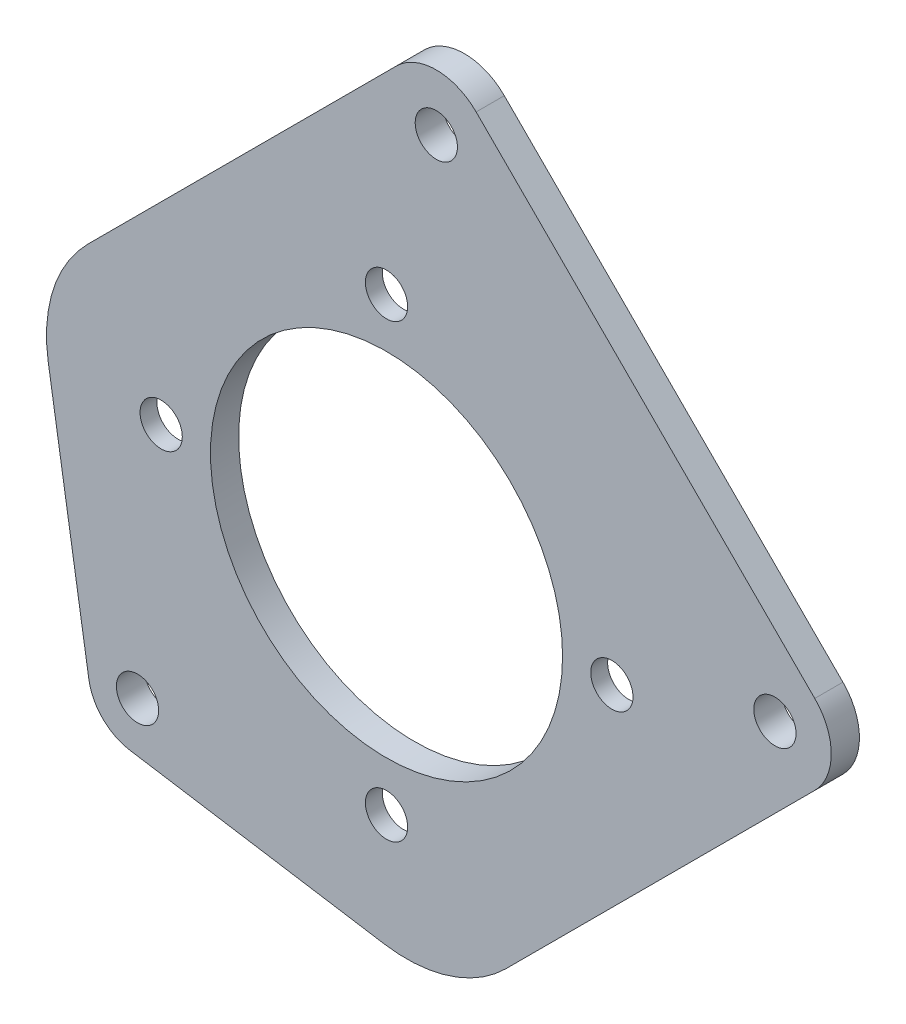
ISO-10303-21;
HEADER;
FILE_DESCRIPTION(('STEP AP214'),'2;1');
FILE_NAME('part.step','',(''),(''),'','','');
FILE_SCHEMA(('AUTOMOTIVE_DESIGN { 1 0 10303 214 1 1 1 1 }'));
ENDSEC;
DATA;
#1=APPLICATION_CONTEXT('core data for automotive mechanical design processes');
#2=APPLICATION_PROTOCOL_DEFINITION('international standard','automotive_design',2000,#1);
#3=PRODUCT_CONTEXT('',#1,'mechanical');
#4=PRODUCT('Part','Part','',(#3));
#5=PRODUCT_RELATED_PRODUCT_CATEGORY('part','',(#4));
#6=PRODUCT_DEFINITION_FORMATION('','',#4);
#7=PRODUCT_DEFINITION_CONTEXT('part definition',#1,'design');
#8=PRODUCT_DEFINITION('design','',#6,#7);
#9=PRODUCT_DEFINITION_SHAPE('','',#8);
#10=(LENGTH_UNIT() NAMED_UNIT(*) SI_UNIT(.MILLI.,.METRE.));
#11=(NAMED_UNIT(*) PLANE_ANGLE_UNIT() SI_UNIT($,.RADIAN.));
#12=(NAMED_UNIT(*) SI_UNIT($,.STERADIAN.) SOLID_ANGLE_UNIT());
#13=UNCERTAINTY_MEASURE_WITH_UNIT(LENGTH_MEASURE(1.E-05),#10,'distance_accuracy_value','');
#14=(GEOMETRIC_REPRESENTATION_CONTEXT(3) GLOBAL_UNCERTAINTY_ASSIGNED_CONTEXT((#13)) GLOBAL_UNIT_ASSIGNED_CONTEXT((#10,
#11,#12)) REPRESENTATION_CONTEXT('',''));
#15=CARTESIAN_POINT('',(0.,0.,0.));
#16=DIRECTION('',(0.,0.,1.));
#17=DIRECTION('',(1.,0.,0.));
#18=AXIS2_PLACEMENT_3D('',#15,#16,#17);
#19=CARTESIAN_POINT('',(3.53553390593269,27.5771644662754,2.));
#20=DIRECTION('',(0.,0.,1.));
#21=DIRECTION('',(1.,0.,0.));
#22=AXIS2_PLACEMENT_3D('',#19,#20,#21);
#23=PLANE('',#22);
#24=CARTESIAN_POINT('',(27.5771644662753,3.53553390593279,2.));
#25=DIRECTION('',(0.,0.,1.));
#26=DIRECTION('',(1.,0.,0.));
#27=AXIS2_PLACEMENT_3D('',#24,#25,#26);
#28=CIRCLE('',#27,1.5);
#29=CARTESIAN_POINT('',(29.0771644662753,3.53553390593279,2.));
#30=VERTEX_POINT('',#29);
#31=EDGE_CURVE('E242',#30,#30,#28,.T.);
#32=ORIENTED_EDGE('',*,*,#31,.F.);
#33=EDGE_LOOP('',(#32));
#34=FACE_BOUND('',#33,.T.);
#35=CARTESIAN_POINT('',(0.,-16.,2.));
#36=DIRECTION('',(0.,0.,1.));
#37=DIRECTION('',(1.,0.,0.));
#38=AXIS2_PLACEMENT_3D('',#35,#36,#37);
#39=CIRCLE('',#38,1.5);
#40=CARTESIAN_POINT('',(1.5,-16.,2.));
#41=VERTEX_POINT('',#40);
#42=EDGE_CURVE('E249',#41,#41,#39,.T.);
#43=ORIENTED_EDGE('',*,*,#42,.F.);
#44=EDGE_LOOP('',(#43));
#45=FACE_BOUND('',#44,.T.);
#46=CARTESIAN_POINT('',(-17.6776695296637,-17.6776695296637,2.));
#47=DIRECTION('',(0.,0.,1.));
#48=DIRECTION('',(1.,0.,0.));
#49=AXIS2_PLACEMENT_3D('',#46,#47,#48);
#50=CIRCLE('',#49,1.5);
#51=CARTESIAN_POINT('',(-16.1776695296637,-17.6776695296637,2.));
#52=VERTEX_POINT('',#51);
#53=EDGE_CURVE('E255',#52,#52,#50,.T.);
#54=ORIENTED_EDGE('',*,*,#53,.F.);
#55=EDGE_LOOP('',(#54));
#56=FACE_BOUND('',#55,.T.);
#57=CARTESIAN_POINT('',(0.,0.,2.));
#58=DIRECTION('',(0.,0.,1.));
#59=DIRECTION('',(1.,0.,0.));
#60=AXIS2_PLACEMENT_3D('',#57,#58,#59);
#61=CIRCLE('',#60,12.5);
#62=CARTESIAN_POINT('',(12.5,0.,2.));
#63=VERTEX_POINT('',#62);
#64=EDGE_CURVE('E146',#63,#63,#61,.T.);
#65=ORIENTED_EDGE('',*,*,#64,.F.);
#66=EDGE_LOOP('',(#65));
#67=FACE_BOUND('',#66,.T.);
#68=CARTESIAN_POINT('',(3.53553390593269,27.5771644662754,2.));
#69=DIRECTION('',(0.,0.,1.));
#70=DIRECTION('',(1.,0.,0.));
#71=AXIS2_PLACEMENT_3D('',#68,#69,#70);
#72=CIRCLE('',#71,4.);
#73=CARTESIAN_POINT('',(6.36396103067888,30.4055915910216,2.));
#74=VERTEX_POINT('',#73);
#75=CARTESIAN_POINT('',(0.707106781186493,30.4055915910215,2.));
#76=VERTEX_POINT('',#75);
#77=EDGE_CURVE('E161',#74,#76,#72,.T.);
#78=ORIENTED_EDGE('',*,*,#77,.T.);
#79=DIRECTION('',(-0.707106781186546,-0.707106781186549,0.));
#80=VECTOR('',#79,1.);
#81=CARTESIAN_POINT('',(-21.2132034355964,8.48528137423853,2.));
#82=LINE('',#81,#80);
#83=CARTESIAN_POINT('',(-21.2132034355964,8.48528137423853,2.));
#84=VERTEX_POINT('',#83);
#85=EDGE_CURVE('E99',#76,#84,#82,.T.);
#86=ORIENTED_EDGE('',*,*,#85,.T.);
#87=CARTESIAN_POINT('',(-14.1421356237309,1.41421356237307,2.));
#88=DIRECTION('',(0.,0.,1.));
#89=DIRECTION('',(1.,0.,0.));
#90=AXIS2_PLACEMENT_3D('',#87,#88,#89);
#91=CIRCLE('',#90,10.);
#92=CARTESIAN_POINT('',(-24.0171858698271,-0.161661634803625,2.));
#93=VERTEX_POINT('',#92);
#94=EDGE_CURVE('E267',#84,#93,#91,.T.);
#95=ORIENTED_EDGE('',*,*,#94,.T.);
#96=DIRECTION('',(0.15758751971767,-0.987505024609613,0.));
#97=VECTOR('',#96,1.);
#98=CARTESIAN_POINT('',(-24.0171858698271,-0.161661634803625,2.));
#99=LINE('',#98,#97);
#100=CARTESIAN_POINT('',(-21.1339371157973,-18.2292258486756,2.));
#101=VERTEX_POINT('',#100);
#102=EDGE_CURVE('E269',#93,#101,#99,.T.);
#103=ORIENTED_EDGE('',*,*,#102,.T.);
#104=CARTESIAN_POINT('',(-17.6776695296637,-17.6776695296637,2.));
#105=DIRECTION('',(0.,0.,1.));
#106=DIRECTION('',(1.,0.,0.));
#107=AXIS2_PLACEMENT_3D('',#104,#105,#106);
#108=CIRCLE('',#107,3.5);
#109=CARTESIAN_POINT('',(-18.2292258486755,-21.1339371157974,2.));
#110=VERTEX_POINT('',#109);
#111=EDGE_CURVE('E271',#101,#110,#108,.T.);
#112=ORIENTED_EDGE('',*,*,#111,.T.);
#113=DIRECTION('',(0.987505024609614,-0.157587519717666,0.));
#114=VECTOR('',#113,1.);
#115=CARTESIAN_POINT('',(-0.161661634803526,-24.0171858698271,2.));
#116=LINE('',#115,#114);
#117=CARTESIAN_POINT('',(-0.161661634803524,-24.0171858698271,2.));
#118=VERTEX_POINT('',#117);
#119=EDGE_CURVE('E273',#110,#118,#116,.T.);
#120=ORIENTED_EDGE('',*,*,#119,.T.);
#121=CARTESIAN_POINT('',(1.41421356237313,-14.1421356237309,2.));
#122=DIRECTION('',(0.,0.,1.));
#123=DIRECTION('',(-1.,0.,0.));
#124=AXIS2_PLACEMENT_3D('',#121,#122,#123);
#125=CIRCLE('',#124,9.99999999999999);
#126=CARTESIAN_POINT('',(8.48528137423862,-21.2132034355964,2.));
#127=VERTEX_POINT('',#126);
#128=EDGE_CURVE('E124',#118,#127,#125,.T.);
#129=ORIENTED_EDGE('',*,*,#128,.T.);
#130=DIRECTION('',(0.707106781186546,0.707106781186549,0.));
#131=VECTOR('',#130,1.);
#132=CARTESIAN_POINT('',(8.48528137423862,-21.2132034355964,2.));
#133=LINE('',#132,#131);
#134=CARTESIAN_POINT('',(30.4055915910215,0.707106781186607,2.));
#135=VERTEX_POINT('',#134);
#136=EDGE_CURVE('E118',#127,#135,#133,.T.);
#137=ORIENTED_EDGE('',*,*,#136,.T.);
#138=CARTESIAN_POINT('',(27.5771644662753,3.53553390593279,2.));
#139=DIRECTION('',(0.,0.,1.));
#140=DIRECTION('',(1.,0.,0.));
#141=AXIS2_PLACEMENT_3D('',#138,#139,#140);
#142=CIRCLE('',#141,4.);
#143=CARTESIAN_POINT('',(30.4055915910215,6.36396103067899,2.));
#144=VERTEX_POINT('',#143);
#145=EDGE_CURVE('E122',#135,#144,#142,.T.);
#146=ORIENTED_EDGE('',*,*,#145,.T.);
#147=DIRECTION('',(-0.707106781186549,0.707106781186546,0.));
#148=VECTOR('',#147,1.);
#149=CARTESIAN_POINT('',(6.36396103067888,30.4055915910216,2.));
#150=LINE('',#149,#148);
#151=EDGE_CURVE('E49',#144,#74,#150,.T.);
#152=ORIENTED_EDGE('',*,*,#151,.T.);
#153=EDGE_LOOP('',(#78,#86,#95,#103,#112,#120,#129,#137,#146,#152));
#154=FACE_BOUND('',#153,.T.);
#155=CARTESIAN_POINT('',(0.,16.,2.));
#156=DIRECTION('',(0.,0.,1.));
#157=DIRECTION('',(1.,0.,0.));
#158=AXIS2_PLACEMENT_3D('',#155,#156,#157);
#159=CIRCLE('',#158,1.5);
#160=CARTESIAN_POINT('',(1.5,16.,2.));
#161=VERTEX_POINT('',#160);
#162=EDGE_CURVE('E258',#161,#161,#159,.T.);
#163=ORIENTED_EDGE('',*,*,#162,.F.);
#164=EDGE_LOOP('',(#163));
#165=FACE_BOUND('',#164,.T.);
#166=CARTESIAN_POINT('',(16.,0.,2.));
#167=DIRECTION('',(0.,0.,1.));
#168=DIRECTION('',(1.,0.,0.));
#169=AXIS2_PLACEMENT_3D('',#166,#167,#168);
#170=CIRCLE('',#169,1.5);
#171=CARTESIAN_POINT('',(17.5,0.,2.));
#172=VERTEX_POINT('',#171);
#173=EDGE_CURVE('E252',#172,#172,#170,.T.);
#174=ORIENTED_EDGE('',*,*,#173,.F.);
#175=EDGE_LOOP('',(#174));
#176=FACE_BOUND('',#175,.T.);
#177=CARTESIAN_POINT('',(-16.,0.,2.));
#178=DIRECTION('',(0.,0.,1.));
#179=DIRECTION('',(1.,0.,0.));
#180=AXIS2_PLACEMENT_3D('',#177,#178,#179);
#181=CIRCLE('',#180,1.5);
#182=CARTESIAN_POINT('',(-14.5,0.,2.));
#183=VERTEX_POINT('',#182);
#184=EDGE_CURVE('E245',#183,#183,#181,.T.);
#185=ORIENTED_EDGE('',*,*,#184,.F.);
#186=EDGE_LOOP('',(#185));
#187=FACE_BOUND('',#186,.T.);
#188=CARTESIAN_POINT('',(3.53553390593269,27.5771644662754,2.));
#189=DIRECTION('',(0.,0.,1.));
#190=DIRECTION('',(-1.,0.,0.));
#191=AXIS2_PLACEMENT_3D('',#188,#189,#190);
#192=CIRCLE('',#191,1.5);
#193=CARTESIAN_POINT('',(2.03553390593269,27.5771644662754,2.));
#194=VERTEX_POINT('',#193);
#195=EDGE_CURVE('E237',#194,#194,#192,.T.);
#196=ORIENTED_EDGE('',*,*,#195,.F.);
#197=EDGE_LOOP('',(#196));
#198=FACE_BOUND('',#197,.T.);
#199=ADVANCED_FACE('F32',(#34,#45,#56,#67,#154,#165,#176,#187,#198),#23,.T.);
#200=CARTESIAN_POINT('',(3.53553390593269,27.5771644662754,0.));
#201=DIRECTION('',(0.,0.,1.));
#202=DIRECTION('',(1.,0.,0.));
#203=AXIS2_PLACEMENT_3D('',#200,#201,#202);
#204=PLANE('',#203);
#205=CARTESIAN_POINT('',(0.,16.,0.));
#206=DIRECTION('',(0.,0.,1.));
#207=DIRECTION('',(1.,0.,0.));
#208=AXIS2_PLACEMENT_3D('',#205,#206,#207);
#209=CIRCLE('',#208,2.88564064605511);
#210=CARTESIAN_POINT('',(2.88564064605511,16.,0.));
#211=VERTEX_POINT('',#210);
#212=EDGE_CURVE('E191',#211,#211,#209,.T.);
#213=ORIENTED_EDGE('',*,*,#212,.T.);
#214=EDGE_LOOP('',(#213));
#215=FACE_BOUND('',#214,.T.);
#216=CARTESIAN_POINT('',(16.,0.,0.));
#217=DIRECTION('',(0.,0.,1.));
#218=DIRECTION('',(1.,0.,0.));
#219=AXIS2_PLACEMENT_3D('',#216,#217,#218);
#220=CIRCLE('',#219,2.88564064605509);
#221=CARTESIAN_POINT('',(18.8856406460551,0.,0.));
#222=VERTEX_POINT('',#221);
#223=EDGE_CURVE('E188',#222,#222,#220,.T.);
#224=ORIENTED_EDGE('',*,*,#223,.T.);
#225=EDGE_LOOP('',(#224));
#226=FACE_BOUND('',#225,.T.);
#227=CARTESIAN_POINT('',(0.,-16.,0.));
#228=DIRECTION('',(0.,0.,1.));
#229=DIRECTION('',(1.,0.,0.));
#230=AXIS2_PLACEMENT_3D('',#227,#228,#229);
#231=CIRCLE('',#230,2.88564064605511);
#232=CARTESIAN_POINT('',(2.88564064605511,-16.,0.));
#233=VERTEX_POINT('',#232);
#234=EDGE_CURVE('E185',#233,#233,#231,.T.);
#235=ORIENTED_EDGE('',*,*,#234,.T.);
#236=EDGE_LOOP('',(#235));
#237=FACE_BOUND('',#236,.T.);
#238=CARTESIAN_POINT('',(-16.,0.,0.));
#239=DIRECTION('',(0.,0.,1.));
#240=DIRECTION('',(1.,0.,0.));
#241=AXIS2_PLACEMENT_3D('',#238,#239,#240);
#242=CIRCLE('',#241,2.88564064605509);
#243=CARTESIAN_POINT('',(-13.1143593539449,0.,0.));
#244=VERTEX_POINT('',#243);
#245=EDGE_CURVE('E182',#244,#244,#242,.T.);
#246=ORIENTED_EDGE('',*,*,#245,.T.);
#247=EDGE_LOOP('',(#246));
#248=FACE_BOUND('',#247,.T.);
#249=CARTESIAN_POINT('',(27.5771644662753,3.53553390593279,0.));
#250=DIRECTION('',(0.,0.,1.));
#251=DIRECTION('',(1.,0.,0.));
#252=AXIS2_PLACEMENT_3D('',#249,#250,#251);
#253=CIRCLE('',#252,1.5);
#254=CARTESIAN_POINT('',(29.0771644662753,3.53553390593279,0.));
#255=VERTEX_POINT('',#254);
#256=EDGE_CURVE('E222',#255,#255,#253,.T.);
#257=ORIENTED_EDGE('',*,*,#256,.T.);
#258=EDGE_LOOP('',(#257));
#259=FACE_BOUND('',#258,.T.);
#260=CARTESIAN_POINT('',(-17.6776695296637,-17.6776695296637,0.));
#261=DIRECTION('',(0.,0.,1.));
#262=DIRECTION('',(1.,0.,0.));
#263=AXIS2_PLACEMENT_3D('',#260,#261,#262);
#264=CIRCLE('',#263,1.5);
#265=CARTESIAN_POINT('',(-16.1776695296637,-17.6776695296637,0.));
#266=VERTEX_POINT('',#265);
#267=EDGE_CURVE('E226',#266,#266,#264,.T.);
#268=ORIENTED_EDGE('',*,*,#267,.T.);
#269=EDGE_LOOP('',(#268));
#270=FACE_BOUND('',#269,.T.);
#271=CARTESIAN_POINT('',(0.,0.,0.));
#272=DIRECTION('',(0.,0.,1.));
#273=DIRECTION('',(1.,0.,0.));
#274=AXIS2_PLACEMENT_3D('',#271,#272,#273);
#275=CIRCLE('',#274,12.5);
#276=CARTESIAN_POINT('',(12.5,0.,0.));
#277=VERTEX_POINT('',#276);
#278=EDGE_CURVE('E230',#277,#277,#275,.T.);
#279=ORIENTED_EDGE('',*,*,#278,.T.);
#280=EDGE_LOOP('',(#279));
#281=FACE_BOUND('',#280,.T.);
#282=CARTESIAN_POINT('',(3.53553390593269,27.5771644662754,0.));
#283=DIRECTION('',(0.,0.,1.));
#284=DIRECTION('',(1.,0.,0.));
#285=AXIS2_PLACEMENT_3D('',#282,#283,#284);
#286=CIRCLE('',#285,4.);
#287=CARTESIAN_POINT('',(6.36396103067888,30.4055915910216,0.));
#288=VERTEX_POINT('',#287);
#289=CARTESIAN_POINT('',(0.707106781186493,30.4055915910215,0.));
#290=VERTEX_POINT('',#289);
#291=EDGE_CURVE('E142',#288,#290,#286,.T.);
#292=ORIENTED_EDGE('',*,*,#291,.F.);
#293=DIRECTION('',(-0.707106781186549,0.707106781186546,0.));
#294=VECTOR('',#293,1.);
#295=CARTESIAN_POINT('',(6.36396103067888,30.4055915910216,0.));
#296=LINE('',#295,#294);
#297=CARTESIAN_POINT('',(30.4055915910215,6.36396103067899,0.));
#298=VERTEX_POINT('',#297);
#299=EDGE_CURVE('E90',#298,#288,#296,.T.);
#300=ORIENTED_EDGE('',*,*,#299,.F.);
#301=CARTESIAN_POINT('',(27.5771644662753,3.53553390593279,0.));
#302=DIRECTION('',(0.,0.,1.));
#303=DIRECTION('',(1.,0.,0.));
#304=AXIS2_PLACEMENT_3D('',#301,#302,#303);
#305=CIRCLE('',#304,4.);
#306=CARTESIAN_POINT('',(30.4055915910215,0.707106781186607,0.));
#307=VERTEX_POINT('',#306);
#308=EDGE_CURVE('E84',#307,#298,#305,.T.);
#309=ORIENTED_EDGE('',*,*,#308,.F.);
#310=DIRECTION('',(0.707106781186546,0.707106781186549,0.));
#311=VECTOR('',#310,1.);
#312=CARTESIAN_POINT('',(8.48528137423862,-21.2132034355964,0.));
#313=LINE('',#312,#311);
#314=CARTESIAN_POINT('',(8.48528137423862,-21.2132034355964,0.));
#315=VERTEX_POINT('',#314);
#316=EDGE_CURVE('E132',#315,#307,#313,.T.);
#317=ORIENTED_EDGE('',*,*,#316,.F.);
#318=CARTESIAN_POINT('',(1.41421356237313,-14.1421356237309,0.));
#319=DIRECTION('',(0.,0.,1.));
#320=DIRECTION('',(-1.,0.,0.));
#321=AXIS2_PLACEMENT_3D('',#318,#319,#320);
#322=CIRCLE('',#321,9.99999999999999);
#323=CARTESIAN_POINT('',(-0.161661634803524,-24.0171858698271,0.));
#324=VERTEX_POINT('',#323);
#325=EDGE_CURVE('E156',#324,#315,#322,.T.);
#326=ORIENTED_EDGE('',*,*,#325,.F.);
#327=DIRECTION('',(0.987505024609614,-0.157587519717666,0.));
#328=VECTOR('',#327,1.);
#329=CARTESIAN_POINT('',(-0.161661634803526,-24.0171858698271,0.));
#330=LINE('',#329,#328);
#331=CARTESIAN_POINT('',(-18.2292258486755,-21.1339371157974,0.));
#332=VERTEX_POINT('',#331);
#333=EDGE_CURVE('E154',#332,#324,#330,.T.);
#334=ORIENTED_EDGE('',*,*,#333,.F.);
#335=CARTESIAN_POINT('',(-17.6776695296637,-17.6776695296637,0.));
#336=DIRECTION('',(0.,0.,1.));
#337=DIRECTION('',(1.,0.,0.));
#338=AXIS2_PLACEMENT_3D('',#335,#336,#337);
#339=CIRCLE('',#338,3.5);
#340=CARTESIAN_POINT('',(-21.1339371157973,-18.2292258486756,0.));
#341=VERTEX_POINT('',#340);
#342=EDGE_CURVE('E152',#341,#332,#339,.T.);
#343=ORIENTED_EDGE('',*,*,#342,.F.);
#344=DIRECTION('',(0.15758751971767,-0.987505024609613,0.));
#345=VECTOR('',#344,1.);
#346=CARTESIAN_POINT('',(-24.0171858698271,-0.161661634803625,0.));
#347=LINE('',#346,#345);
#348=CARTESIAN_POINT('',(-24.0171858698271,-0.161661634803625,0.));
#349=VERTEX_POINT('',#348);
#350=EDGE_CURVE('E150',#349,#341,#347,.T.);
#351=ORIENTED_EDGE('',*,*,#350,.F.);
#352=CARTESIAN_POINT('',(-14.1421356237309,1.41421356237307,0.));
#353=DIRECTION('',(0.,0.,1.));
#354=DIRECTION('',(1.,0.,0.));
#355=AXIS2_PLACEMENT_3D('',#352,#353,#354);
#356=CIRCLE('',#355,10.);
#357=CARTESIAN_POINT('',(-21.2132034355964,8.48528137423853,0.));
#358=VERTEX_POINT('',#357);
#359=EDGE_CURVE('E148',#358,#349,#356,.T.);
#360=ORIENTED_EDGE('',*,*,#359,.F.);
#361=DIRECTION('',(-0.707106781186546,-0.707106781186549,0.));
#362=VECTOR('',#361,1.);
#363=CARTESIAN_POINT('',(-21.2132034355964,8.48528137423853,0.));
#364=LINE('',#363,#362);
#365=EDGE_CURVE('E145',#290,#358,#364,.T.);
#366=ORIENTED_EDGE('',*,*,#365,.F.);
#367=EDGE_LOOP('',(#292,#300,#309,#317,#326,#334,#343,#351,#360,#366));
#368=FACE_BOUND('',#367,.T.);
#369=CARTESIAN_POINT('',(3.53553390593269,27.5771644662754,0.));
#370=DIRECTION('',(0.,0.,1.));
#371=DIRECTION('',(-1.,0.,0.));
#372=AXIS2_PLACEMENT_3D('',#369,#370,#371);
#373=CIRCLE('',#372,1.5);
#374=CARTESIAN_POINT('',(2.03553390593269,27.5771644662754,0.));
#375=VERTEX_POINT('',#374);
#376=EDGE_CURVE('E235',#375,#375,#373,.T.);
#377=ORIENTED_EDGE('',*,*,#376,.T.);
#378=EDGE_LOOP('',(#377));
#379=FACE_BOUND('',#378,.T.);
#380=ADVANCED_FACE('F211',(#215,#226,#237,#248,#259,#270,#281,#368,#379),#204,.F.);
#381=CARTESIAN_POINT('',(3.53553390593269,27.5771644662754,2.));
#382=DIRECTION('',(0.,0.,-1.));
#383=DIRECTION('',(-1.,0.,0.));
#384=AXIS2_PLACEMENT_3D('',#381,#382,#383);
#385=CYLINDRICAL_SURFACE('',#384,4.);
#386=ORIENTED_EDGE('',*,*,#291,.T.);
#387=DIRECTION('',(0.,0.,-1.));
#388=VECTOR('',#387,1.);
#389=CARTESIAN_POINT('',(0.707106781186493,30.4055915910215,2.));
#390=LINE('',#389,#388);
#391=EDGE_CURVE('E180',#76,#290,#390,.T.);
#392=ORIENTED_EDGE('',*,*,#391,.F.);
#393=ORIENTED_EDGE('',*,*,#77,.F.);
#394=DIRECTION('',(0.,0.,-1.));
#395=VECTOR('',#394,1.);
#396=CARTESIAN_POINT('',(6.36396103067888,30.4055915910216,2.));
#397=LINE('',#396,#395);
#398=EDGE_CURVE('E138',#74,#288,#397,.T.);
#399=ORIENTED_EDGE('',*,*,#398,.T.);
#400=EDGE_LOOP('',(#386,#392,#393,#399));
#401=FACE_BOUND('',#400,.T.);
#402=ADVANCED_FACE('F214',(#401),#385,.T.);
#403=CARTESIAN_POINT('',(-21.2132034355964,8.48528137423853,2.));
#404=DIRECTION('',(0.707106781186549,-0.707106781186546,0.));
#405=DIRECTION('',(0.707106781186546,0.707106781186549,0.));
#406=AXIS2_PLACEMENT_3D('',#403,#404,#405);
#407=PLANE('',#406);
#408=ORIENTED_EDGE('',*,*,#365,.T.);
#409=DIRECTION('',(0.,0.,-1.));
#410=VECTOR('',#409,1.);
#411=CARTESIAN_POINT('',(-21.2132034355964,8.48528137423853,2.));
#412=LINE('',#411,#410);
#413=EDGE_CURVE('E177',#84,#358,#412,.T.);
#414=ORIENTED_EDGE('',*,*,#413,.F.);
#415=ORIENTED_EDGE('',*,*,#85,.F.);
#416=ORIENTED_EDGE('',*,*,#391,.T.);
#417=EDGE_LOOP('',(#408,#414,#415,#416));
#418=FACE_BOUND('',#417,.T.);
#419=ADVANCED_FACE('F298',(#418),#407,.F.);
#420=CARTESIAN_POINT('',(-14.1421356237309,1.41421356237307,2.));
#421=DIRECTION('',(0.,0.,-1.));
#422=DIRECTION('',(-1.,0.,0.));
#423=AXIS2_PLACEMENT_3D('',#420,#421,#422);
#424=CYLINDRICAL_SURFACE('',#423,10.);
#425=ORIENTED_EDGE('',*,*,#359,.T.);
#426=DIRECTION('',(0.,0.,-1.));
#427=VECTOR('',#426,1.);
#428=CARTESIAN_POINT('',(-24.0171858698271,-0.161661634803625,2.));
#429=LINE('',#428,#427);
#430=EDGE_CURVE('E174',#93,#349,#429,.T.);
#431=ORIENTED_EDGE('',*,*,#430,.F.);
#432=ORIENTED_EDGE('',*,*,#94,.F.);
#433=ORIENTED_EDGE('',*,*,#413,.T.);
#434=EDGE_LOOP('',(#425,#431,#432,#433));
#435=FACE_BOUND('',#434,.T.);
#436=ADVANCED_FACE('F296',(#435),#424,.T.);
#437=CARTESIAN_POINT('',(-24.0171858698271,-0.161661634803625,2.));
#438=DIRECTION('',(0.987505024609613,0.15758751971767,0.));
#439=DIRECTION('',(-0.15758751971767,0.987505024609613,0.));
#440=AXIS2_PLACEMENT_3D('',#437,#438,#439);
#441=PLANE('',#440);
#442=ORIENTED_EDGE('',*,*,#350,.T.);
#443=DIRECTION('',(0.,0.,-1.));
#444=VECTOR('',#443,1.);
#445=CARTESIAN_POINT('',(-21.1339371157973,-18.2292258486756,2.));
#446=LINE('',#445,#444);
#447=EDGE_CURVE('E171',#101,#341,#446,.T.);
#448=ORIENTED_EDGE('',*,*,#447,.F.);
#449=ORIENTED_EDGE('',*,*,#102,.F.);
#450=ORIENTED_EDGE('',*,*,#430,.T.);
#451=EDGE_LOOP('',(#442,#448,#449,#450));
#452=FACE_BOUND('',#451,.T.);
#453=ADVANCED_FACE('F292',(#452),#441,.F.);
#454=CARTESIAN_POINT('',(-17.6776695296637,-17.6776695296637,2.));
#455=DIRECTION('',(0.,0.,-1.));
#456=DIRECTION('',(-1.,0.,0.));
#457=AXIS2_PLACEMENT_3D('',#454,#455,#456);
#458=CYLINDRICAL_SURFACE('',#457,3.5);
#459=ORIENTED_EDGE('',*,*,#342,.T.);
#460=DIRECTION('',(0.,0.,-1.));
#461=VECTOR('',#460,1.);
#462=CARTESIAN_POINT('',(-18.2292258486755,-21.1339371157974,2.));
#463=LINE('',#462,#461);
#464=EDGE_CURVE('E168',#110,#332,#463,.T.);
#465=ORIENTED_EDGE('',*,*,#464,.F.);
#466=ORIENTED_EDGE('',*,*,#111,.F.);
#467=ORIENTED_EDGE('',*,*,#447,.T.);
#468=EDGE_LOOP('',(#459,#465,#466,#467));
#469=FACE_BOUND('',#468,.T.);
#470=ADVANCED_FACE('F288',(#469),#458,.T.);
#471=CARTESIAN_POINT('',(-0.161661634803526,-24.0171858698271,2.));
#472=DIRECTION('',(0.157587519717666,0.987505024609614,0.));
#473=DIRECTION('',(-0.987505024609614,0.157587519717666,0.));
#474=AXIS2_PLACEMENT_3D('',#471,#472,#473);
#475=PLANE('',#474);
#476=ORIENTED_EDGE('',*,*,#333,.T.);
#477=DIRECTION('',(0.,0.,-1.));
#478=VECTOR('',#477,1.);
#479=CARTESIAN_POINT('',(-0.161661634803524,-24.0171858698271,2.));
#480=LINE('',#479,#478);
#481=EDGE_CURVE('E165',#118,#324,#480,.T.);
#482=ORIENTED_EDGE('',*,*,#481,.F.);
#483=ORIENTED_EDGE('',*,*,#119,.F.);
#484=ORIENTED_EDGE('',*,*,#464,.T.);
#485=EDGE_LOOP('',(#476,#482,#483,#484));
#486=FACE_BOUND('',#485,.T.);
#487=ADVANCED_FACE('F279',(#486),#475,.F.);
#488=CARTESIAN_POINT('',(1.41421356237313,-14.1421356237309,2.));
#489=DIRECTION('',(0.,0.,-1.));
#490=DIRECTION('',(-1.,0.,0.));
#491=AXIS2_PLACEMENT_3D('',#488,#489,#490);
#492=CYLINDRICAL_SURFACE('',#491,9.99999999999999);
#493=ORIENTED_EDGE('',*,*,#325,.T.);
#494=DIRECTION('',(0.,0.,-1.));
#495=VECTOR('',#494,1.);
#496=CARTESIAN_POINT('',(8.48528137423862,-21.2132034355964,2.));
#497=LINE('',#496,#495);
#498=EDGE_CURVE('E133',#127,#315,#497,.T.);
#499=ORIENTED_EDGE('',*,*,#498,.F.);
#500=ORIENTED_EDGE('',*,*,#128,.F.);
#501=ORIENTED_EDGE('',*,*,#481,.T.);
#502=EDGE_LOOP('',(#493,#499,#500,#501));
#503=FACE_BOUND('',#502,.T.);
#504=ADVANCED_FACE('F283',(#503),#492,.T.);
#505=CARTESIAN_POINT('',(8.48528137423862,-21.2132034355964,2.));
#506=DIRECTION('',(-0.707106781186549,0.707106781186546,0.));
#507=DIRECTION('',(-0.707106781186546,-0.707106781186549,0.));
#508=AXIS2_PLACEMENT_3D('',#505,#506,#507);
#509=PLANE('',#508);
#510=ORIENTED_EDGE('',*,*,#316,.T.);
#511=DIRECTION('',(0.,0.,-1.));
#512=VECTOR('',#511,1.);
#513=CARTESIAN_POINT('',(30.4055915910215,0.707106781186607,2.));
#514=LINE('',#513,#512);
#515=EDGE_CURVE('E129',#135,#307,#514,.T.);
#516=ORIENTED_EDGE('',*,*,#515,.F.);
#517=ORIENTED_EDGE('',*,*,#136,.F.);
#518=ORIENTED_EDGE('',*,*,#498,.T.);
#519=EDGE_LOOP('',(#510,#516,#517,#518));
#520=FACE_BOUND('',#519,.T.);
#521=ADVANCED_FACE('F130',(#520),#509,.F.);
#522=CARTESIAN_POINT('',(27.5771644662753,3.53553390593279,2.));
#523=DIRECTION('',(0.,0.,-1.));
#524=DIRECTION('',(-1.,0.,0.));
#525=AXIS2_PLACEMENT_3D('',#522,#523,#524);
#526=CYLINDRICAL_SURFACE('',#525,4.);
#527=ORIENTED_EDGE('',*,*,#308,.T.);
#528=DIRECTION('',(0.,0.,-1.));
#529=VECTOR('',#528,1.);
#530=CARTESIAN_POINT('',(30.4055915910215,6.36396103067899,2.));
#531=LINE('',#530,#529);
#532=EDGE_CURVE('E134',#144,#298,#531,.T.);
#533=ORIENTED_EDGE('',*,*,#532,.F.);
#534=ORIENTED_EDGE('',*,*,#145,.F.);
#535=ORIENTED_EDGE('',*,*,#515,.T.);
#536=EDGE_LOOP('',(#527,#533,#534,#535));
#537=FACE_BOUND('',#536,.T.);
#538=ADVANCED_FACE('F136',(#537),#526,.T.);
#539=CARTESIAN_POINT('',(6.36396103067888,30.4055915910216,2.));
#540=DIRECTION('',(-0.707106781186546,-0.707106781186549,0.));
#541=DIRECTION('',(0.707106781186549,-0.707106781186546,0.));
#542=AXIS2_PLACEMENT_3D('',#539,#540,#541);
#543=PLANE('',#542);
#544=ORIENTED_EDGE('',*,*,#299,.T.);
#545=ORIENTED_EDGE('',*,*,#398,.F.);
#546=ORIENTED_EDGE('',*,*,#151,.F.);
#547=ORIENTED_EDGE('',*,*,#532,.T.);
#548=EDGE_LOOP('',(#544,#545,#546,#547));
#549=FACE_BOUND('',#548,.T.);
#550=ADVANCED_FACE('F301',(#549),#543,.F.);
#551=CARTESIAN_POINT('',(0.,0.,2.));
#552=DIRECTION('',(0.,0.,-1.));
#553=DIRECTION('',(-1.,0.,0.));
#554=AXIS2_PLACEMENT_3D('',#551,#552,#553);
#555=CYLINDRICAL_SURFACE('',#554,12.5);
#556=ORIENTED_EDGE('',*,*,#64,.T.);
#557=EDGE_LOOP('',(#556));
#558=FACE_BOUND('',#557,.T.);
#559=ORIENTED_EDGE('',*,*,#278,.F.);
#560=EDGE_LOOP('',(#559));
#561=FACE_BOUND('',#560,.T.);
#562=ADVANCED_FACE('F303',(#558,#561),#555,.F.);
#563=CARTESIAN_POINT('',(0.,16.,2.));
#564=DIRECTION('',(0.,0.,-1.));
#565=DIRECTION('',(-1.,0.,0.));
#566=AXIS2_PLACEMENT_3D('',#563,#564,#565);
#567=CYLINDRICAL_SURFACE('',#566,1.5);
#568=CARTESIAN_POINT('',(0.,16.,0.80000000000001));
#569=DIRECTION('',(0.,0.,1.));
#570=DIRECTION('',(1.,0.,0.));
#571=AXIS2_PLACEMENT_3D('',#568,#569,#570);
#572=CIRCLE('',#571,1.5);
#573=CARTESIAN_POINT('',(1.5,16.,0.80000000000001));
#574=VERTEX_POINT('',#573);
#575=EDGE_CURVE('E194',#574,#574,#572,.F.);
#576=ORIENTED_EDGE('',*,*,#575,.T.);
#577=EDGE_LOOP('',(#576));
#578=FACE_BOUND('',#577,.T.);
#579=ORIENTED_EDGE('',*,*,#162,.T.);
#580=EDGE_LOOP('',(#579));
#581=FACE_BOUND('',#580,.T.);
#582=ADVANCED_FACE('F309',(#578,#581),#567,.F.);
#583=CARTESIAN_POINT('',(-17.6776695296637,-17.6776695296637,2.));
#584=DIRECTION('',(0.,0.,-1.));
#585=DIRECTION('',(-1.,0.,0.));
#586=AXIS2_PLACEMENT_3D('',#583,#584,#585);
#587=CYLINDRICAL_SURFACE('',#586,1.5);
#588=ORIENTED_EDGE('',*,*,#53,.T.);
#589=EDGE_LOOP('',(#588));
#590=FACE_BOUND('',#589,.T.);
#591=ORIENTED_EDGE('',*,*,#267,.F.);
#592=EDGE_LOOP('',(#591));
#593=FACE_BOUND('',#592,.T.);
#594=ADVANCED_FACE('F323',(#590,#593),#587,.F.);
#595=CARTESIAN_POINT('',(16.,0.,2.));
#596=DIRECTION('',(0.,0.,-1.));
#597=DIRECTION('',(-1.,0.,0.));
#598=AXIS2_PLACEMENT_3D('',#595,#596,#597);
#599=CYLINDRICAL_SURFACE('',#598,1.5);
#600=CARTESIAN_POINT('',(16.,0.,0.799999999999995));
#601=DIRECTION('',(0.,0.,1.));
#602=DIRECTION('',(1.,0.,0.));
#603=AXIS2_PLACEMENT_3D('',#600,#601,#602);
#604=CIRCLE('',#603,1.5);
#605=CARTESIAN_POINT('',(17.5,0.,0.799999999999995));
#606=VERTEX_POINT('',#605);
#607=EDGE_CURVE('E197',#606,#606,#604,.F.);
#608=ORIENTED_EDGE('',*,*,#607,.T.);
#609=EDGE_LOOP('',(#608));
#610=FACE_BOUND('',#609,.T.);
#611=ORIENTED_EDGE('',*,*,#173,.T.);
#612=EDGE_LOOP('',(#611));
#613=FACE_BOUND('',#612,.T.);
#614=ADVANCED_FACE('F327',(#610,#613),#599,.F.);
#615=CARTESIAN_POINT('',(0.,-16.,2.));
#616=DIRECTION('',(0.,0.,-1.));
#617=DIRECTION('',(-1.,0.,0.));
#618=AXIS2_PLACEMENT_3D('',#615,#616,#617);
#619=CYLINDRICAL_SURFACE('',#618,1.5);
#620=CARTESIAN_POINT('',(0.,-16.,0.800000000000009));
#621=DIRECTION('',(0.,0.,1.));
#622=DIRECTION('',(1.,0.,0.));
#623=AXIS2_PLACEMENT_3D('',#620,#621,#622);
#624=CIRCLE('',#623,1.5);
#625=CARTESIAN_POINT('',(1.5,-16.,0.800000000000009));
#626=VERTEX_POINT('',#625);
#627=EDGE_CURVE('E41',#626,#626,#624,.F.);
#628=ORIENTED_EDGE('',*,*,#627,.T.);
#629=EDGE_LOOP('',(#628));
#630=FACE_BOUND('',#629,.T.);
#631=ORIENTED_EDGE('',*,*,#42,.T.);
#632=EDGE_LOOP('',(#631));
#633=FACE_BOUND('',#632,.T.);
#634=ADVANCED_FACE('F202',(#630,#633),#619,.F.);
#635=CARTESIAN_POINT('',(-16.,0.,2.));
#636=DIRECTION('',(0.,0.,-1.));
#637=DIRECTION('',(-1.,0.,0.));
#638=AXIS2_PLACEMENT_3D('',#635,#636,#637);
#639=CYLINDRICAL_SURFACE('',#638,1.5);
#640=CARTESIAN_POINT('',(-16.,0.,0.799999999999995));
#641=DIRECTION('',(0.,0.,1.));
#642=DIRECTION('',(1.,0.,0.));
#643=AXIS2_PLACEMENT_3D('',#640,#641,#642);
#644=CIRCLE('',#643,1.5);
#645=CARTESIAN_POINT('',(-14.5,0.,0.799999999999995));
#646=VERTEX_POINT('',#645);
#647=EDGE_CURVE('E11',#646,#646,#644,.F.);
#648=ORIENTED_EDGE('',*,*,#647,.T.);
#649=EDGE_LOOP('',(#648));
#650=FACE_BOUND('',#649,.T.);
#651=ORIENTED_EDGE('',*,*,#184,.T.);
#652=EDGE_LOOP('',(#651));
#653=FACE_BOUND('',#652,.T.);
#654=ADVANCED_FACE('F334',(#650,#653),#639,.F.);
#655=CARTESIAN_POINT('',(27.5771644662753,3.53553390593279,2.));
#656=DIRECTION('',(0.,0.,-1.));
#657=DIRECTION('',(-1.,0.,0.));
#658=AXIS2_PLACEMENT_3D('',#655,#656,#657);
#659=CYLINDRICAL_SURFACE('',#658,1.5);
#660=ORIENTED_EDGE('',*,*,#31,.T.);
#661=EDGE_LOOP('',(#660));
#662=FACE_BOUND('',#661,.T.);
#663=ORIENTED_EDGE('',*,*,#256,.F.);
#664=EDGE_LOOP('',(#663));
#665=FACE_BOUND('',#664,.T.);
#666=ADVANCED_FACE('F337',(#662,#665),#659,.F.);
#667=CARTESIAN_POINT('',(3.53553390593269,27.5771644662754,2.));
#668=DIRECTION('',(0.,0.,-1.));
#669=DIRECTION('',(-1.,0.,0.));
#670=AXIS2_PLACEMENT_3D('',#667,#668,#669);
#671=CYLINDRICAL_SURFACE('',#670,1.5);
#672=ORIENTED_EDGE('',*,*,#195,.T.);
#673=EDGE_LOOP('',(#672));
#674=FACE_BOUND('',#673,.T.);
#675=ORIENTED_EDGE('',*,*,#376,.F.);
#676=EDGE_LOOP('',(#675));
#677=FACE_BOUND('',#676,.T.);
#678=ADVANCED_FACE('F341',(#674,#677),#671,.F.);
#679=CARTESIAN_POINT('',(0.,16.,0.));
#680=DIRECTION('',(0.,0.,-1.));
#681=DIRECTION('',(-1.,0.,0.));
#682=AXIS2_PLACEMENT_3D('',#679,#680,#681);
#683=CONICAL_SURFACE('',#682,2.88564064605511,1.04719755119659);
#684=ORIENTED_EDGE('',*,*,#575,.F.);
#685=EDGE_LOOP('',(#684));
#686=FACE_BOUND('',#685,.T.);
#687=ORIENTED_EDGE('',*,*,#212,.F.);
#688=EDGE_LOOP('',(#687));
#689=FACE_BOUND('',#688,.T.);
#690=ADVANCED_FACE('F344',(#686,#689),#683,.F.);
#691=CARTESIAN_POINT('',(16.,0.,0.));
#692=DIRECTION('',(0.,0.,-1.));
#693=DIRECTION('',(-1.,0.,0.));
#694=AXIS2_PLACEMENT_3D('',#691,#692,#693);
#695=CONICAL_SURFACE('',#694,2.88564064605509,1.0471975511966);
#696=ORIENTED_EDGE('',*,*,#607,.F.);
#697=EDGE_LOOP('',(#696));
#698=FACE_BOUND('',#697,.T.);
#699=ORIENTED_EDGE('',*,*,#223,.F.);
#700=EDGE_LOOP('',(#699));
#701=FACE_BOUND('',#700,.T.);
#702=ADVANCED_FACE('F208',(#698,#701),#695,.F.);
#703=CARTESIAN_POINT('',(0.,-16.,0.));
#704=DIRECTION('',(0.,0.,-1.));
#705=DIRECTION('',(-1.,0.,0.));
#706=AXIS2_PLACEMENT_3D('',#703,#704,#705);
#707=CONICAL_SURFACE('',#706,2.88564064605511,1.04719755119659);
#708=ORIENTED_EDGE('',*,*,#627,.F.);
#709=EDGE_LOOP('',(#708));
#710=FACE_BOUND('',#709,.T.);
#711=ORIENTED_EDGE('',*,*,#234,.F.);
#712=EDGE_LOOP('',(#711));
#713=FACE_BOUND('',#712,.T.);
#714=ADVANCED_FACE('F205',(#710,#713),#707,.F.);
#715=CARTESIAN_POINT('',(-16.,0.,0.));
#716=DIRECTION('',(0.,0.,-1.));
#717=DIRECTION('',(-1.,0.,0.));
#718=AXIS2_PLACEMENT_3D('',#715,#716,#717);
#719=CONICAL_SURFACE('',#718,2.88564064605509,1.0471975511966);
#720=ORIENTED_EDGE('',*,*,#647,.F.);
#721=EDGE_LOOP('',(#720));
#722=FACE_BOUND('',#721,.T.);
#723=ORIENTED_EDGE('',*,*,#245,.F.);
#724=EDGE_LOOP('',(#723));
#725=FACE_BOUND('',#724,.T.);
#726=ADVANCED_FACE('F34',(#722,#725),#719,.F.);
#727=CLOSED_SHELL('',(#199,#380,#402,#419,#436,#453,#470,#487,#504,#521,#538,#550,#562,#582,
#594,#614,#634,#654,#666,#678,#690,#702,#714,#726));
#728=MANIFOLD_SOLID_BREP('B2',#727);
#729=ADVANCED_BREP_SHAPE_REPRESENTATION('',(#18,#728),#14);
#730=SHAPE_DEFINITION_REPRESENTATION(#9,#729);
ENDSEC;
END-ISO-10303-21;
